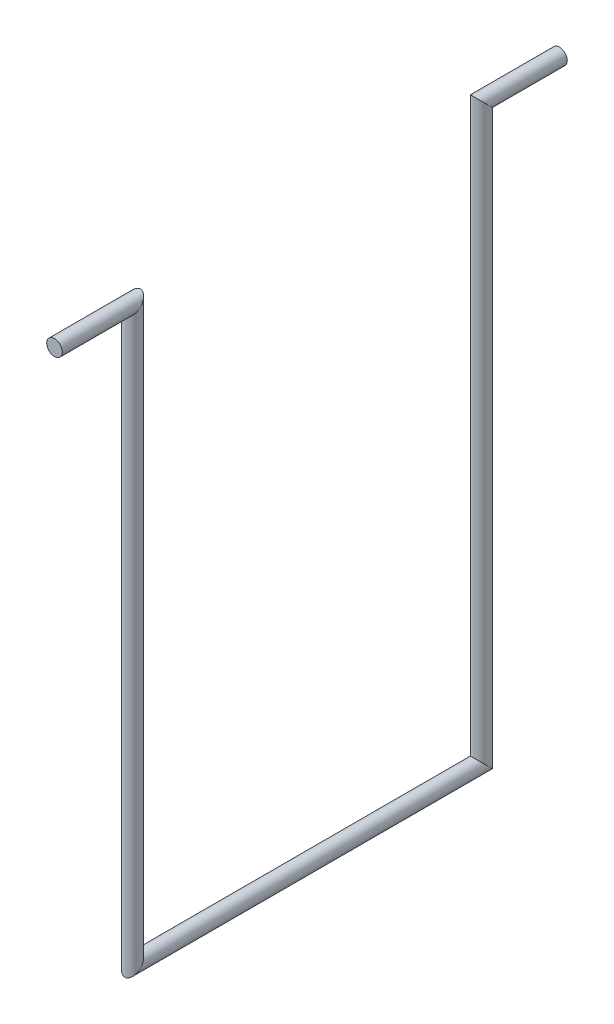
ISO-10303-21;
HEADER;
FILE_DESCRIPTION(('STEP AP214'),'2;1');
FILE_NAME('part.step','',(''),(''),'','','');
FILE_SCHEMA(('AUTOMOTIVE_DESIGN { 1 0 10303 214 1 1 1 1 }'));
ENDSEC;
DATA;
#1=APPLICATION_CONTEXT('core data for automotive mechanical design processes');
#2=APPLICATION_PROTOCOL_DEFINITION('international standard','automotive_design',2000,#1);
#3=PRODUCT_CONTEXT('',#1,'mechanical');
#4=PRODUCT('Part','Part','',(#3));
#5=PRODUCT_RELATED_PRODUCT_CATEGORY('part','',(#4));
#6=PRODUCT_DEFINITION_FORMATION('','',#4);
#7=PRODUCT_DEFINITION_CONTEXT('part definition',#1,'design');
#8=PRODUCT_DEFINITION('design','',#6,#7);
#9=PRODUCT_DEFINITION_SHAPE('','',#8);
#10=(LENGTH_UNIT() NAMED_UNIT(*) SI_UNIT(.MILLI.,.METRE.));
#11=(NAMED_UNIT(*) PLANE_ANGLE_UNIT() SI_UNIT($,.RADIAN.));
#12=(NAMED_UNIT(*) SI_UNIT($,.STERADIAN.) SOLID_ANGLE_UNIT());
#13=UNCERTAINTY_MEASURE_WITH_UNIT(LENGTH_MEASURE(1.E-05),#10,'distance_accuracy_value','');
#14=(GEOMETRIC_REPRESENTATION_CONTEXT(3) GLOBAL_UNCERTAINTY_ASSIGNED_CONTEXT((#13)) GLOBAL_UNIT_ASSIGNED_CONTEXT((#10,
#11,#12)) REPRESENTATION_CONTEXT('',''));
#15=CARTESIAN_POINT('',(0.,0.,0.));
#16=DIRECTION('',(0.,0.,1.));
#17=DIRECTION('',(1.,0.,0.));
#18=AXIS2_PLACEMENT_3D('',#15,#16,#17);
#19=CARTESIAN_POINT('',(0.,0.,7.5));
#20=DIRECTION('',(0.,0.,1.));
#21=DIRECTION('',(1.,0.,0.));
#22=AXIS2_PLACEMENT_3D('',#19,#20,#21);
#23=PLANE('',#22);
#24=CARTESIAN_POINT('',(0.,0.,7.5));
#25=DIRECTION('',(0.,0.,1.));
#26=DIRECTION('',(1.,0.,0.));
#27=AXIS2_PLACEMENT_3D('',#24,#25,#26);
#28=CIRCLE('',#27,0.75);
#29=CARTESIAN_POINT('',(0.75,0.,7.5));
#30=VERTEX_POINT('',#29);
#31=EDGE_CURVE('E40',#30,#30,#28,.T.);
#32=ORIENTED_EDGE('',*,*,#31,.T.);
#33=EDGE_LOOP('',(#32));
#34=FACE_BOUND('',#33,.T.);
#35=ADVANCED_FACE('F37',(#34),#23,.T.);
#36=CARTESIAN_POINT('',(0.,0.,-41.));
#37=DIRECTION('',(0.,0.,1.));
#38=DIRECTION('',(1.,0.,0.));
#39=AXIS2_PLACEMENT_3D('',#36,#37,#38);
#40=PLANE('',#39);
#41=CARTESIAN_POINT('',(0.,0.,-41.));
#42=DIRECTION('',(0.,0.,1.));
#43=DIRECTION('',(1.,0.,0.));
#44=AXIS2_PLACEMENT_3D('',#41,#42,#43);
#45=CIRCLE('',#44,0.75);
#46=CARTESIAN_POINT('',(0.75,0.,-41.));
#47=VERTEX_POINT('',#46);
#48=EDGE_CURVE('E44',#47,#47,#45,.T.);
#49=ORIENTED_EDGE('',*,*,#48,.F.);
#50=EDGE_LOOP('',(#49));
#51=FACE_BOUND('',#50,.T.);
#52=ADVANCED_FACE('F67',(#51),#40,.F.);
#53=CARTESIAN_POINT('',(0.,0.,-1.75));
#54=DIRECTION('',(0.,0.,1.));
#55=DIRECTION('',(0.,-1.,0.));
#56=AXIS2_PLACEMENT_3D('',#53,#54,#55);
#57=CYLINDRICAL_SURFACE('',#56,0.75);
#58=CARTESIAN_POINT('',(0.,0.,0.));
#59=DIRECTION('',(0.,0.707106781186547,0.707106781186548));
#60=DIRECTION('',(0.,0.707106781186548,-0.707106781186547));
#61=AXIS2_PLACEMENT_3D('',#58,#59,#60);
#62=ELLIPSE('',#61,1.06066017177982,0.75);
#63=CARTESIAN_POINT('',(0.,0.750000000000007,-0.750000000000001));
#64=VERTEX_POINT('',#63);
#65=EDGE_CURVE('E56',#64,#64,#62,.F.);
#66=ORIENTED_EDGE('',*,*,#65,.F.);
#67=EDGE_LOOP('',(#66));
#68=FACE_BOUND('',#67,.T.);
#69=ORIENTED_EDGE('',*,*,#31,.F.);
#70=EDGE_LOOP('',(#69));
#71=FACE_BOUND('',#70,.T.);
#72=ADVANCED_FACE('F64',(#68,#71),#57,.T.);
#73=CARTESIAN_POINT('',(0.,-56.75,0.));
#74=DIRECTION('',(0.,1.,0.));
#75=DIRECTION('',(0.,0.,1.));
#76=AXIS2_PLACEMENT_3D('',#73,#74,#75);
#77=CYLINDRICAL_SURFACE('',#76,0.75);
#78=CARTESIAN_POINT('',(0.,-55.,0.));
#79=DIRECTION('',(0.,0.707106781186547,0.707106781186547));
#80=DIRECTION('',(0.,-0.707106781186548,0.707106781186548));
#81=AXIS2_PLACEMENT_3D('',#78,#79,#80);
#82=ELLIPSE('',#81,1.06066017177982,0.75);
#83=CARTESIAN_POINT('',(0.,-55.75,0.749999999999986));
#84=VERTEX_POINT('',#83);
#85=EDGE_CURVE('E54',#84,#84,#82,.F.);
#86=ORIENTED_EDGE('',*,*,#85,.F.);
#87=EDGE_LOOP('',(#86));
#88=FACE_BOUND('',#87,.T.);
#89=ORIENTED_EDGE('',*,*,#65,.T.);
#90=EDGE_LOOP('',(#89));
#91=FACE_BOUND('',#90,.T.);
#92=ADVANCED_FACE('F66',(#88,#91),#77,.T.);
#93=CARTESIAN_POINT('',(0.,-55.,-35.25));
#94=DIRECTION('',(0.,0.,1.));
#95=DIRECTION('',(0.,-1.,0.));
#96=AXIS2_PLACEMENT_3D('',#93,#94,#95);
#97=CYLINDRICAL_SURFACE('',#96,0.75);
#98=CARTESIAN_POINT('',(0.,-55.,-33.5));
#99=DIRECTION('',(0.,-0.707106781186548,0.707106781186548));
#100=DIRECTION('',(0.,-0.707106781186548,-0.707106781186548));
#101=AXIS2_PLACEMENT_3D('',#98,#99,#100);
#102=ELLIPSE('',#101,1.06066017177982,0.75);
#103=CARTESIAN_POINT('',(0.,-55.75,-34.25));
#104=VERTEX_POINT('',#103);
#105=EDGE_CURVE('E49',#104,#104,#102,.F.);
#106=ORIENTED_EDGE('',*,*,#105,.F.);
#107=EDGE_LOOP('',(#106));
#108=FACE_BOUND('',#107,.T.);
#109=ORIENTED_EDGE('',*,*,#85,.T.);
#110=EDGE_LOOP('',(#109));
#111=FACE_BOUND('',#110,.T.);
#112=ADVANCED_FACE('F74',(#108,#111),#97,.T.);
#113=CARTESIAN_POINT('',(0.,1.75000000000001,-33.5));
#114=DIRECTION('',(0.,-1.,0.));
#115=DIRECTION('',(0.,0.,-1.));
#116=AXIS2_PLACEMENT_3D('',#113,#114,#115);
#117=CYLINDRICAL_SURFACE('',#116,0.75);
#118=CARTESIAN_POINT('',(0.,0.,-33.5));
#119=DIRECTION('',(0.,-0.707106781186548,0.707106781186547));
#120=DIRECTION('',(0.,0.707106781186547,0.707106781186548));
#121=AXIS2_PLACEMENT_3D('',#118,#119,#120);
#122=ELLIPSE('',#121,1.06066017177982,0.75);
#123=CARTESIAN_POINT('',(0.,0.750000000000007,-32.75));
#124=VERTEX_POINT('',#123);
#125=EDGE_CURVE('E10',#124,#124,#122,.F.);
#126=ORIENTED_EDGE('',*,*,#125,.F.);
#127=EDGE_LOOP('',(#126));
#128=FACE_BOUND('',#127,.T.);
#129=ORIENTED_EDGE('',*,*,#105,.T.);
#130=EDGE_LOOP('',(#129));
#131=FACE_BOUND('',#130,.T.);
#132=ADVANCED_FACE('F80',(#128,#131),#117,.T.);
#133=CARTESIAN_POINT('',(0.,0.,-41.));
#134=DIRECTION('',(0.,0.,1.));
#135=DIRECTION('',(1.,0.,0.));
#136=AXIS2_PLACEMENT_3D('',#133,#134,#135);
#137=CYLINDRICAL_SURFACE('',#136,0.75);
#138=ORIENTED_EDGE('',*,*,#48,.T.);
#139=EDGE_LOOP('',(#138));
#140=FACE_BOUND('',#139,.T.);
#141=ORIENTED_EDGE('',*,*,#125,.T.);
#142=EDGE_LOOP('',(#141));
#143=FACE_BOUND('',#142,.T.);
#144=ADVANCED_FACE('F78',(#140,#143),#137,.T.);
#145=CLOSED_SHELL('',(#35,#52,#72,#92,#112,#132,#144));
#146=MANIFOLD_SOLID_BREP('B2',#145);
#147=ADVANCED_BREP_SHAPE_REPRESENTATION('',(#18,#146),#14);
#148=SHAPE_DEFINITION_REPRESENTATION(#9,#147);
ENDSEC;
END-ISO-10303-21;
